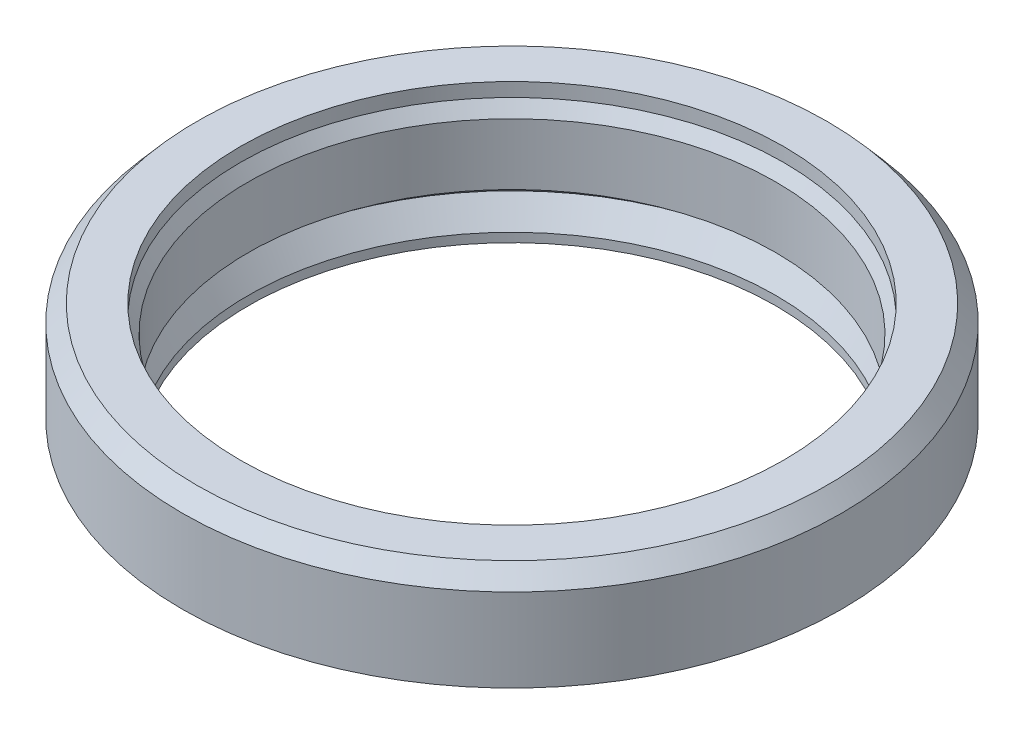
ISO-10303-21;
HEADER;
FILE_DESCRIPTION(('STEP AP214'),'2;1');
FILE_NAME('part.step','',(''),(''),'','','');
FILE_SCHEMA(('AUTOMOTIVE_DESIGN { 1 0 10303 214 1 1 1 1 }'));
ENDSEC;
DATA;
#1=APPLICATION_CONTEXT('core data for automotive mechanical design processes');
#2=APPLICATION_PROTOCOL_DEFINITION('international standard','automotive_design',2000,#1);
#3=PRODUCT_CONTEXT('',#1,'mechanical');
#4=PRODUCT('Part','Part','',(#3));
#5=PRODUCT_RELATED_PRODUCT_CATEGORY('part','',(#4));
#6=PRODUCT_DEFINITION_FORMATION('','',#4);
#7=PRODUCT_DEFINITION_CONTEXT('part definition',#1,'design');
#8=PRODUCT_DEFINITION('design','',#6,#7);
#9=PRODUCT_DEFINITION_SHAPE('','',#8);
#10=(LENGTH_UNIT() NAMED_UNIT(*) SI_UNIT(.MILLI.,.METRE.));
#11=(NAMED_UNIT(*) PLANE_ANGLE_UNIT() SI_UNIT($,.RADIAN.));
#12=(NAMED_UNIT(*) SI_UNIT($,.STERADIAN.) SOLID_ANGLE_UNIT());
#13=UNCERTAINTY_MEASURE_WITH_UNIT(LENGTH_MEASURE(1.E-05),#10,'distance_accuracy_value','');
#14=(GEOMETRIC_REPRESENTATION_CONTEXT(3) GLOBAL_UNCERTAINTY_ASSIGNED_CONTEXT((#13)) GLOBAL_UNIT_ASSIGNED_CONTEXT((#10,
#11,#12)) REPRESENTATION_CONTEXT('',''));
#15=CARTESIAN_POINT('',(0.,0.,0.));
#16=DIRECTION('',(0.,0.,1.));
#17=DIRECTION('',(1.,0.,0.));
#18=AXIS2_PLACEMENT_3D('',#15,#16,#17);
#19=CARTESIAN_POINT('',(0.,1.50344951244718,0.));
#20=DIRECTION('',(0.,-1.,0.));
#21=DIRECTION('',(0.,0.,-1.));
#22=AXIS2_PLACEMENT_3D('',#19,#20,#21);
#23=CONICAL_SURFACE('',#22,8.4746217494831,0.909219469299368);
#24=CARTESIAN_POINT('',(0.,1.87300646214803,0.));
#25=DIRECTION('',(0.,1.,0.));
#26=DIRECTION('',(0.,0.,1.));
#27=AXIS2_PLACEMENT_3D('',#24,#25,#26);
#28=CIRCLE('',#27,8.);
#29=CARTESIAN_POINT('',(0.,1.87300646214803,8.));
#30=VERTEX_POINT('',#29);
#31=EDGE_CURVE('E59',#30,#30,#28,.T.);
#32=ORIENTED_EDGE('',*,*,#31,.T.);
#33=EDGE_LOOP('',(#32));
#34=FACE_BOUND('',#33,.T.);
#35=CARTESIAN_POINT('',(0.,1.50344951244718,0.));
#36=DIRECTION('',(0.,1.,0.));
#37=DIRECTION('',(0.,0.,1.));
#38=AXIS2_PLACEMENT_3D('',#35,#36,#37);
#39=CIRCLE('',#38,8.4746217494831);
#40=CARTESIAN_POINT('',(0.,1.50344951244718,8.4746217494831));
#41=VERTEX_POINT('',#40);
#42=EDGE_CURVE('E103',#41,#41,#39,.T.);
#43=ORIENTED_EDGE('',*,*,#42,.F.);
#44=EDGE_LOOP('',(#43));
#45=FACE_BOUND('',#44,.T.);
#46=ADVANCED_FACE('F45',(#34,#45),#23,.F.);
#47=CARTESIAN_POINT('',(0.,26.0986959657604,0.));
#48=DIRECTION('',(0.,1.,0.));
#49=DIRECTION('',(0.,0.,1.));
#50=AXIS2_PLACEMENT_3D('',#47,#48,#49);
#51=CYLINDRICAL_SURFACE('',#50,8.);
#52=CARTESIAN_POINT('',(0.,3.73055649870235,0.));
#53=DIRECTION('',(0.,1.,0.));
#54=DIRECTION('',(0.,0.,1.));
#55=AXIS2_PLACEMENT_3D('',#52,#53,#54);
#56=CIRCLE('',#55,8.);
#57=CARTESIAN_POINT('',(0.,3.73055649870235,8.));
#58=VERTEX_POINT('',#57);
#59=EDGE_CURVE('E65',#58,#58,#56,.T.);
#60=ORIENTED_EDGE('',*,*,#59,.T.);
#61=EDGE_LOOP('',(#60));
#62=FACE_BOUND('',#61,.T.);
#63=ORIENTED_EDGE('',*,*,#31,.F.);
#64=EDGE_LOOP('',(#63));
#65=FACE_BOUND('',#64,.T.);
#66=ADVANCED_FACE('F113',(#62,#65),#51,.F.);
#67=CARTESIAN_POINT('',(0.,3.73055649870235,0.));
#68=DIRECTION('',(0.,1.,0.));
#69=DIRECTION('',(0.,0.,1.));
#70=AXIS2_PLACEMENT_3D('',#67,#68,#69);
#71=CONICAL_SURFACE('',#70,8.,0.55259550371704);
#72=CARTESIAN_POINT('',(0.,4.12029158232673,0.));
#73=DIRECTION('',(0.,1.,0.));
#74=DIRECTION('',(0.,0.,1.));
#75=AXIS2_PLACEMENT_3D('',#72,#73,#74);
#76=CIRCLE('',#75,8.24034263484696);
#77=CARTESIAN_POINT('',(0.,4.12029158232673,8.24034263484696));
#78=VERTEX_POINT('',#77);
#79=EDGE_CURVE('E71',#78,#78,#76,.T.);
#80=ORIENTED_EDGE('',*,*,#79,.T.);
#81=EDGE_LOOP('',(#80));
#82=FACE_BOUND('',#81,.T.);
#83=ORIENTED_EDGE('',*,*,#59,.F.);
#84=EDGE_LOOP('',(#83));
#85=FACE_BOUND('',#84,.T.);
#86=ADVANCED_FACE('F118',(#82,#85),#71,.F.);
#87=CARTESIAN_POINT('',(0.,26.0986959657604,0.));
#88=DIRECTION('',(0.,1.,0.));
#89=DIRECTION('',(0.,0.,1.));
#90=AXIS2_PLACEMENT_3D('',#87,#88,#89);
#91=CYLINDRICAL_SURFACE('',#90,8.24034263484696);
#92=CARTESIAN_POINT('',(0.,4.53930742408738,0.));
#93=DIRECTION('',(0.,1.,0.));
#94=DIRECTION('',(0.,0.,1.));
#95=AXIS2_PLACEMENT_3D('',#92,#93,#94);
#96=CIRCLE('',#95,8.24034263484696);
#97=CARTESIAN_POINT('',(0.,4.53930742408738,8.24034263484696));
#98=VERTEX_POINT('',#97);
#99=EDGE_CURVE('E75',#98,#98,#96,.T.);
#100=ORIENTED_EDGE('',*,*,#99,.T.);
#101=EDGE_LOOP('',(#100));
#102=FACE_BOUND('',#101,.T.);
#103=ORIENTED_EDGE('',*,*,#79,.F.);
#104=EDGE_LOOP('',(#103));
#105=FACE_BOUND('',#104,.T.);
#106=ADVANCED_FACE('F124',(#102,#105),#91,.F.);
#107=CARTESIAN_POINT('',(-8.24034263484696,4.53930742408738,0.));
#108=DIRECTION('',(0.,1.,0.));
#109=DIRECTION('',(0.,0.,1.));
#110=AXIS2_PLACEMENT_3D('',#107,#108,#109);
#111=PLANE('',#110);
#112=CARTESIAN_POINT('',(0.,4.53930742408738,0.));
#113=DIRECTION('',(0.,1.,0.));
#114=DIRECTION('',(0.,0.,1.));
#115=AXIS2_PLACEMENT_3D('',#112,#113,#114);
#116=CIRCLE('',#115,9.55896792381629);
#117=CARTESIAN_POINT('',(0.,4.53930742408738,9.55896792381629));
#118=VERTEX_POINT('',#117);
#119=EDGE_CURVE('E79',#118,#118,#116,.T.);
#120=ORIENTED_EDGE('',*,*,#119,.T.);
#121=EDGE_LOOP('',(#120));
#122=FACE_BOUND('',#121,.T.);
#123=ORIENTED_EDGE('',*,*,#99,.F.);
#124=EDGE_LOOP('',(#123));
#125=FACE_BOUND('',#124,.T.);
#126=ADVANCED_FACE('F128',(#122,#125),#111,.T.);
#127=CARTESIAN_POINT('',(0.,4.53930742408738,0.));
#128=DIRECTION('',(0.,-1.,0.));
#129=DIRECTION('',(0.,0.,-1.));
#130=AXIS2_PLACEMENT_3D('',#127,#128,#129);
#131=CONICAL_SURFACE('',#130,9.55896792381629,0.709682175195729);
#132=CARTESIAN_POINT('',(0.,4.02630535035488,0.));
#133=DIRECTION('',(0.,1.,0.));
#134=DIRECTION('',(0.,0.,1.));
#135=AXIS2_PLACEMENT_3D('',#132,#133,#134);
#136=CIRCLE('',#135,9.99962448835879);
#137=CARTESIAN_POINT('',(0.,4.02630535035488,9.99962448835879));
#138=VERTEX_POINT('',#137);
#139=EDGE_CURVE('E83',#138,#138,#136,.T.);
#140=ORIENTED_EDGE('',*,*,#139,.T.);
#141=EDGE_LOOP('',(#140));
#142=FACE_BOUND('',#141,.T.);
#143=ORIENTED_EDGE('',*,*,#119,.F.);
#144=EDGE_LOOP('',(#143));
#145=FACE_BOUND('',#144,.T.);
#146=ADVANCED_FACE('F132',(#142,#145),#131,.T.);
#147=CARTESIAN_POINT('',(0.,26.0986959657604,0.));
#148=DIRECTION('',(0.,1.,0.));
#149=DIRECTION('',(0.,0.,1.));
#150=AXIS2_PLACEMENT_3D('',#147,#148,#149);
#151=CYLINDRICAL_SURFACE('',#150,9.99962448835879);
#152=CARTESIAN_POINT('',(0.,1.50344951244718,0.));
#153=DIRECTION('',(0.,1.,0.));
#154=DIRECTION('',(0.,0.,1.));
#155=AXIS2_PLACEMENT_3D('',#152,#153,#154);
#156=CIRCLE('',#155,9.99962448835879);
#157=CARTESIAN_POINT('',(0.,1.50344951244718,9.99962448835879));
#158=VERTEX_POINT('',#157);
#159=EDGE_CURVE('E87',#158,#158,#156,.T.);
#160=ORIENTED_EDGE('',*,*,#159,.T.);
#161=EDGE_LOOP('',(#160));
#162=FACE_BOUND('',#161,.T.);
#163=ORIENTED_EDGE('',*,*,#139,.F.);
#164=EDGE_LOOP('',(#163));
#165=FACE_BOUND('',#164,.T.);
#166=ADVANCED_FACE('F136',(#162,#165),#151,.T.);
#167=CARTESIAN_POINT('',(-9.99962448835879,1.50344951244718,0.));
#168=DIRECTION('',(0.,-1.,0.));
#169=DIRECTION('',(0.,0.,-1.));
#170=AXIS2_PLACEMENT_3D('',#167,#168,#169);
#171=PLANE('',#170);
#172=CARTESIAN_POINT('',(0.,1.50344951244718,0.));
#173=DIRECTION('',(0.,-1.,0.));
#174=DIRECTION('',(0.,0.,-1.));
#175=AXIS2_PLACEMENT_3D('',#172,#173,#174);
#176=CIRCLE('',#175,9.17320615802128);
#177=CARTESIAN_POINT('',(0.,1.50344951244718,-9.17320615802128));
#178=VERTEX_POINT('',#177);
#179=EDGE_CURVE('E53',#178,#178,#176,.F.);
#180=ORIENTED_EDGE('',*,*,#179,.T.);
#181=EDGE_LOOP('',(#180));
#182=FACE_BOUND('',#181,.T.);
#183=ORIENTED_EDGE('',*,*,#159,.F.);
#184=EDGE_LOOP('',(#183));
#185=FACE_BOUND('',#184,.T.);
#186=ADVANCED_FACE('F140',(#182,#185),#171,.T.);
#187=CARTESIAN_POINT('',(0.,1.50344951244718,0.));
#188=DIRECTION('',(0.,1.,0.));
#189=DIRECTION('',(0.,0.,1.));
#190=AXIS2_PLACEMENT_3D('',#187,#188,#189);
#191=CONICAL_SURFACE('',#190,8.89711842390062,0.561772523563147);
#192=CARTESIAN_POINT('',(0.,1.26979308361319,0.));
#193=DIRECTION('',(0.,1.,0.));
#194=DIRECTION('',(0.,0.,1.));
#195=AXIS2_PLACEMENT_3D('',#192,#193,#194);
#196=CIRCLE('',#195,8.75005003777896);
#197=CARTESIAN_POINT('',(0.,1.26979308361319,8.75005003777896));
#198=VERTEX_POINT('',#197);
#199=EDGE_CURVE('E10',#198,#198,#196,.F.);
#200=ORIENTED_EDGE('',*,*,#199,.T.);
#201=EDGE_LOOP('',(#200));
#202=FACE_BOUND('',#201,.T.);
#203=CARTESIAN_POINT('',(0.,0.475546818802346,0.));
#204=DIRECTION('',(0.,1.,0.));
#205=DIRECTION('',(0.,0.,1.));
#206=AXIS2_PLACEMENT_3D('',#203,#204,#205);
#207=CIRCLE('',#206,8.25013434133615);
#208=CARTESIAN_POINT('',(0.,0.475546818802346,8.25013434133615));
#209=VERTEX_POINT('',#208);
#210=EDGE_CURVE('E91',#209,#209,#207,.T.);
#211=ORIENTED_EDGE('',*,*,#210,.T.);
#212=EDGE_LOOP('',(#211));
#213=FACE_BOUND('',#212,.T.);
#214=ADVANCED_FACE('F144',(#202,#213),#191,.T.);
#215=CARTESIAN_POINT('',(-7.99999999999999,0.475546818802347,0.));
#216=DIRECTION('',(0.,-1.,0.));
#217=DIRECTION('',(0.,0.,-1.));
#218=AXIS2_PLACEMENT_3D('',#215,#216,#217);
#219=PLANE('',#218);
#220=CARTESIAN_POINT('',(0.,0.475546818802346,0.));
#221=DIRECTION('',(0.,1.,0.));
#222=DIRECTION('',(0.,0.,1.));
#223=AXIS2_PLACEMENT_3D('',#220,#221,#222);
#224=CIRCLE('',#223,7.99999999999999);
#225=CARTESIAN_POINT('',(0.,0.475546818802346,7.99999999999999));
#226=VERTEX_POINT('',#225);
#227=EDGE_CURVE('E95',#226,#226,#224,.T.);
#228=ORIENTED_EDGE('',*,*,#227,.T.);
#229=EDGE_LOOP('',(#228));
#230=FACE_BOUND('',#229,.T.);
#231=ORIENTED_EDGE('',*,*,#210,.F.);
#232=EDGE_LOOP('',(#231));
#233=FACE_BOUND('',#232,.T.);
#234=ADVANCED_FACE('F147',(#230,#233),#219,.T.);
#235=CARTESIAN_POINT('',(0.,26.0986959657604,0.));
#236=DIRECTION('',(0.,1.,0.));
#237=DIRECTION('',(0.,0.,1.));
#238=AXIS2_PLACEMENT_3D('',#235,#236,#237);
#239=CYLINDRICAL_SURFACE('',#238,8.);
#240=CARTESIAN_POINT('',(0.,0.749389269075595,0.));
#241=DIRECTION('',(0.,1.,0.));
#242=DIRECTION('',(0.,0.,1.));
#243=AXIS2_PLACEMENT_3D('',#240,#241,#242);
#244=CIRCLE('',#243,8.);
#245=CARTESIAN_POINT('',(0.,0.749389269075595,8.));
#246=VERTEX_POINT('',#245);
#247=EDGE_CURVE('E99',#246,#246,#244,.T.);
#248=ORIENTED_EDGE('',*,*,#247,.T.);
#249=EDGE_LOOP('',(#248));
#250=FACE_BOUND('',#249,.T.);
#251=ORIENTED_EDGE('',*,*,#227,.F.);
#252=EDGE_LOOP('',(#251));
#253=FACE_BOUND('',#252,.T.);
#254=ADVANCED_FACE('F150',(#250,#253),#239,.F.);
#255=CARTESIAN_POINT('',(0.,0.749389269075595,0.));
#256=DIRECTION('',(0.,1.,0.));
#257=DIRECTION('',(0.,0.,1.));
#258=AXIS2_PLACEMENT_3D('',#255,#256,#257);
#259=CONICAL_SURFACE('',#258,8.,0.561772523563147);
#260=ORIENTED_EDGE('',*,*,#42,.T.);
#261=EDGE_LOOP('',(#260));
#262=FACE_BOUND('',#261,.T.);
#263=ORIENTED_EDGE('',*,*,#247,.F.);
#264=EDGE_LOOP('',(#263));
#265=FACE_BOUND('',#264,.T.);
#266=ADVANCED_FACE('F109',(#262,#265),#259,.F.);
#267=CARTESIAN_POINT('',(0.,1.00344951244718,0.));
#268=DIRECTION('',(0.,-1.,0.));
#269=DIRECTION('',(0.,0.,-1.));
#270=AXIS2_PLACEMENT_3D('',#267,#268,#269);
#271=TOROIDAL_SURFACE('',#270,9.17320615802128,0.5);
#272=ORIENTED_EDGE('',*,*,#199,.F.);
#273=EDGE_LOOP('',(#272));
#274=FACE_BOUND('',#273,.T.);
#275=ORIENTED_EDGE('',*,*,#179,.F.);
#276=EDGE_LOOP('',(#275));
#277=FACE_BOUND('',#276,.T.);
#278=ADVANCED_FACE('F47',(#274,#277),#271,.F.);
#279=CLOSED_SHELL('',(#46,#66,#86,#106,#126,#146,#166,#186,#214,#234,#254,#266,#278));
#280=MANIFOLD_SOLID_BREP('B2',#279);
#281=ADVANCED_BREP_SHAPE_REPRESENTATION('',(#18,#280),#14);
#282=SHAPE_DEFINITION_REPRESENTATION(#9,#281);
ENDSEC;
END-ISO-10303-21;
